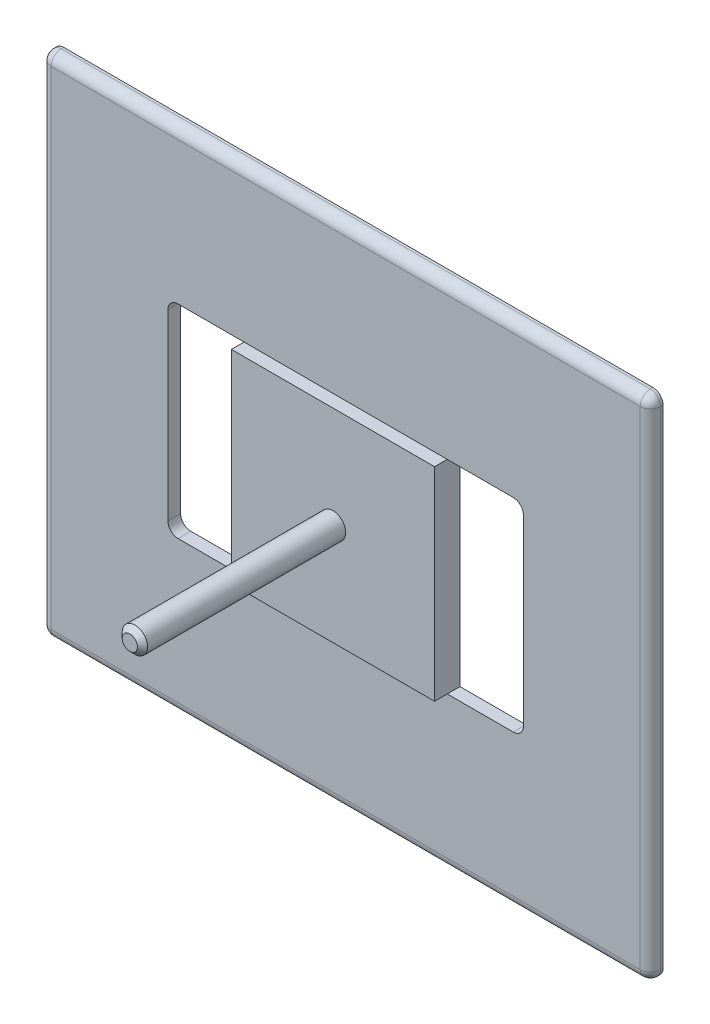
ISO-10303-21;
HEADER;
FILE_DESCRIPTION(('STEP AP214'),'2;1');
FILE_NAME('part.step','',(''),(''),'','','');
FILE_SCHEMA(('AUTOMOTIVE_DESIGN { 1 0 10303 214 1 1 1 1 }'));
ENDSEC;
DATA;
#1=APPLICATION_CONTEXT('core data for automotive mechanical design processes');
#2=APPLICATION_PROTOCOL_DEFINITION('international standard','automotive_design',2000,#1);
#3=PRODUCT_CONTEXT('',#1,'mechanical');
#4=PRODUCT('Part','Part','',(#3));
#5=PRODUCT_RELATED_PRODUCT_CATEGORY('part','',(#4));
#6=PRODUCT_DEFINITION_FORMATION('','',#4);
#7=PRODUCT_DEFINITION_CONTEXT('part definition',#1,'design');
#8=PRODUCT_DEFINITION('design','',#6,#7);
#9=PRODUCT_DEFINITION_SHAPE('','',#8);
#10=(LENGTH_UNIT() NAMED_UNIT(*) SI_UNIT(.MILLI.,.METRE.));
#11=(NAMED_UNIT(*) PLANE_ANGLE_UNIT() SI_UNIT($,.RADIAN.));
#12=(NAMED_UNIT(*) SI_UNIT($,.STERADIAN.) SOLID_ANGLE_UNIT());
#13=UNCERTAINTY_MEASURE_WITH_UNIT(LENGTH_MEASURE(1.E-05),#10,'distance_accuracy_value','');
#14=(GEOMETRIC_REPRESENTATION_CONTEXT(3) GLOBAL_UNCERTAINTY_ASSIGNED_CONTEXT((#13)) GLOBAL_UNIT_ASSIGNED_CONTEXT((#10,
#11,#12)) REPRESENTATION_CONTEXT('',''));
#15=CARTESIAN_POINT('',(0.,0.,0.));
#16=DIRECTION('',(0.,0.,1.));
#17=DIRECTION('',(1.,0.,0.));
#18=AXIS2_PLACEMENT_3D('',#15,#16,#17);
#19=CARTESIAN_POINT('',(0.,0.,5.));
#20=DIRECTION('',(0.,0.,-1.));
#21=DIRECTION('',(-1.,0.,0.));
#22=AXIS2_PLACEMENT_3D('',#19,#20,#21);
#23=PLANE('',#22);
#24=CARTESIAN_POINT('',(0.,0.,5.));
#25=DIRECTION('',(0.,0.,1.));
#26=DIRECTION('',(1.,0.,0.));
#27=AXIS2_PLACEMENT_3D('',#24,#25,#26);
#28=CIRCLE('',#27,2.5);
#29=CARTESIAN_POINT('',(-2.5,0.,5.));
#30=VERTEX_POINT('',#29);
#31=EDGE_CURVE('E292',#30,#30,#28,.T.);
#32=ORIENTED_EDGE('',*,*,#31,.F.);
#33=EDGE_LOOP('',(#32));
#34=FACE_BOUND('',#33,.T.);
#35=DIRECTION('',(0.,1.,0.));
#36=VECTOR('',#35,1.);
#37=CARTESIAN_POINT('',(20.,-20.,5.));
#38=LINE('',#37,#36);
#39=CARTESIAN_POINT('',(20.,-20.,5.));
#40=VERTEX_POINT('',#39);
#41=CARTESIAN_POINT('',(20.,20.,5.));
#42=VERTEX_POINT('',#41);
#43=EDGE_CURVE('E245',#40,#42,#38,.T.);
#44=ORIENTED_EDGE('',*,*,#43,.T.);
#45=DIRECTION('',(-1.,0.,0.));
#46=VECTOR('',#45,1.);
#47=CARTESIAN_POINT('',(-20.,20.,5.));
#48=LINE('',#47,#46);
#49=CARTESIAN_POINT('',(-20.,20.,5.));
#50=VERTEX_POINT('',#49);
#51=EDGE_CURVE('E280',#42,#50,#48,.T.);
#52=ORIENTED_EDGE('',*,*,#51,.T.);
#53=DIRECTION('',(0.,-1.,0.));
#54=VECTOR('',#53,1.);
#55=CARTESIAN_POINT('',(-20.,-20.,5.));
#56=LINE('',#55,#54);
#57=CARTESIAN_POINT('',(-20.,-20.,5.));
#58=VERTEX_POINT('',#57);
#59=EDGE_CURVE('E284',#50,#58,#56,.T.);
#60=ORIENTED_EDGE('',*,*,#59,.T.);
#61=DIRECTION('',(1.,0.,0.));
#62=VECTOR('',#61,1.);
#63=CARTESIAN_POINT('',(-20.,-20.,5.));
#64=LINE('',#63,#62);
#65=EDGE_CURVE('E274',#58,#40,#64,.T.);
#66=ORIENTED_EDGE('',*,*,#65,.T.);
#67=EDGE_LOOP('',(#44,#52,#60,#66));
#68=FACE_BOUND('',#67,.T.);
#69=ADVANCED_FACE('F45',(#34,#68),#23,.F.);
#70=CARTESIAN_POINT('',(0.,0.,45.));
#71=DIRECTION('',(0.,0.,-1.));
#72=DIRECTION('',(-1.,0.,0.));
#73=AXIS2_PLACEMENT_3D('',#70,#71,#72);
#74=CYLINDRICAL_SURFACE('',#73,2.5);
#75=CARTESIAN_POINT('',(0.,0.,44.0000000000001));
#76=DIRECTION('',(0.,0.,1.));
#77=DIRECTION('',(1.,0.,0.));
#78=AXIS2_PLACEMENT_3D('',#75,#76,#77);
#79=CIRCLE('',#78,2.5);
#80=CARTESIAN_POINT('',(-2.5,0.,44.0000000000001));
#81=VERTEX_POINT('',#80);
#82=EDGE_CURVE('E315',#81,#81,#79,.F.);
#83=CARTESIAN_POINT('',(-2.5,0.,44.0000000000001));
#84=CARTESIAN_POINT('',(-2.5,0.,43.5937500000001));
#85=CARTESIAN_POINT('',(-2.5,0.,43.1875000000001));
#86=CARTESIAN_POINT('',(-2.5,0.,42.3750000000001));
#87=CARTESIAN_POINT('',(-2.5,0.,41.9687500000001));
#88=CARTESIAN_POINT('',(-2.5,0.,41.1562500000001));
#89=CARTESIAN_POINT('',(-2.5,0.,40.7500000000001));
#90=CARTESIAN_POINT('',(-2.5,0.,39.9375000000001));
#91=CARTESIAN_POINT('',(-2.5,0.,39.5312500000001));
#92=CARTESIAN_POINT('',(-2.5,0.,38.7187500000001));
#93=CARTESIAN_POINT('',(-2.5,0.,38.3125000000001));
#94=CARTESIAN_POINT('',(-2.5,0.,37.5000000000001));
#95=CARTESIAN_POINT('',(-2.5,0.,37.0937500000001));
#96=CARTESIAN_POINT('',(-2.5,0.,36.2812500000001));
#97=CARTESIAN_POINT('',(-2.5,0.,35.8750000000001));
#98=CARTESIAN_POINT('',(-2.5,0.,35.0625));
#99=CARTESIAN_POINT('',(-2.5,0.,34.6562500000001));
#100=CARTESIAN_POINT('',(-2.5,0.,33.8437500000001));
#101=CARTESIAN_POINT('',(-2.5,0.,33.4375));
#102=CARTESIAN_POINT('',(-2.5,0.,32.625));
#103=CARTESIAN_POINT('',(-2.5,0.,32.21875));
#104=CARTESIAN_POINT('',(-2.5,0.,31.40625));
#105=CARTESIAN_POINT('',(-2.5,0.,31.));
#106=CARTESIAN_POINT('',(-2.5,0.,30.1875));
#107=CARTESIAN_POINT('',(-2.5,0.,29.78125));
#108=CARTESIAN_POINT('',(-2.5,0.,28.96875));
#109=CARTESIAN_POINT('',(-2.5,0.,28.5625));
#110=CARTESIAN_POINT('',(-2.5,0.,27.75));
#111=CARTESIAN_POINT('',(-2.5,0.,27.34375));
#112=CARTESIAN_POINT('',(-2.5,0.,26.53125));
#113=CARTESIAN_POINT('',(-2.5,0.,26.125));
#114=CARTESIAN_POINT('',(-2.5,0.,25.3125));
#115=CARTESIAN_POINT('',(-2.5,0.,24.90625));
#116=CARTESIAN_POINT('',(-2.5,0.,24.09375));
#117=CARTESIAN_POINT('',(-2.5,0.,23.6875));
#118=CARTESIAN_POINT('',(-2.5,0.,22.875));
#119=CARTESIAN_POINT('',(-2.5,0.,22.46875));
#120=CARTESIAN_POINT('',(-2.5,0.,21.65625));
#121=CARTESIAN_POINT('',(-2.5,0.,21.25));
#122=CARTESIAN_POINT('',(-2.5,0.,20.4375));
#123=CARTESIAN_POINT('',(-2.5,0.,20.03125));
#124=CARTESIAN_POINT('',(-2.5,0.,19.21875));
#125=CARTESIAN_POINT('',(-2.5,0.,18.8125));
#126=CARTESIAN_POINT('',(-2.5,0.,18.));
#127=CARTESIAN_POINT('',(-2.5,0.,17.59375));
#128=CARTESIAN_POINT('',(-2.5,0.,16.78125));
#129=CARTESIAN_POINT('',(-2.5,0.,16.375));
#130=CARTESIAN_POINT('',(-2.5,0.,15.5625));
#131=CARTESIAN_POINT('',(-2.5,0.,15.15625));
#132=CARTESIAN_POINT('',(-2.5,0.,14.34375));
#133=CARTESIAN_POINT('',(-2.5,0.,13.9375));
#134=CARTESIAN_POINT('',(-2.5,0.,13.125));
#135=CARTESIAN_POINT('',(-2.5,0.,12.71875));
#136=CARTESIAN_POINT('',(-2.5,0.,11.90625));
#137=CARTESIAN_POINT('',(-2.5,0.,11.5));
#138=CARTESIAN_POINT('',(-2.5,0.,10.6875));
#139=CARTESIAN_POINT('',(-2.5,0.,10.28125));
#140=CARTESIAN_POINT('',(-2.5,0.,9.46875000000001));
#141=CARTESIAN_POINT('',(-2.5,0.,9.06250000000001));
#142=CARTESIAN_POINT('',(-2.5,0.,8.25000000000001));
#143=CARTESIAN_POINT('',(-2.5,0.,7.84375000000001));
#144=CARTESIAN_POINT('',(-2.5,0.,7.03125000000001));
#145=CARTESIAN_POINT('',(-2.5,0.,6.625));
#146=CARTESIAN_POINT('',(-2.5,0.,5.8125));
#147=CARTESIAN_POINT('',(-2.5,0.,5.40625));
#148=CARTESIAN_POINT('',(-2.5,0.,5.));
#149=B_SPLINE_CURVE_WITH_KNOTS('',3,(#83,#84,#85,#86,#87,#88,#89,#90,#91,#92,#93,#94,#95,#96,
#97,#98,#99,#100,#101,#102,#103,#104,#105,#106,#107,#108,#109,#110,#111,#112,#113,#114,#115,
#116,#117,#118,#119,#120,#121,#122,#123,#124,#125,#126,#127,#128,#129,#130,#131,#132,#133,#134,
#135,#136,#137,#138,#139,#140,#141,#142,#143,#144,#145,#146,#147,#148),.UNSPECIFIED.,.F.,.F.,(4,
2,2,2,2,2,2,2,2,2,2,2,2,2,2,2,2,2,2,2,2,2,2,2,2,2,2,2,2,2,2,2,4),(0.,1.21875,2.43750000000001,
3.65625000000001,4.87500000000001,6.09375000000002,7.31250000000001,8.53125000000002,
9.75000000000002,10.96875,12.1875,13.40625,14.625,15.84375,17.0625,18.28125,19.5,20.71875,
21.9375,23.15625,24.375,25.59375,26.8125000000001,28.0312500000001,29.2500000000001,
30.4687500000001,31.6875000000001,32.9062500000001,34.1250000000001,35.3437500000001,
36.5625000000001,37.7812500000001,39.0000000000001),.UNSPECIFIED.);
#150=EDGE_CURVE('BSEAM476',#81,#30,#149,.T.);
#151=ORIENTED_EDGE('',*,*,#82,.T.);
#152=ORIENTED_EDGE('',*,*,#31,.T.);
#153=ORIENTED_EDGE('',*,*,#150,.T.);
#154=ORIENTED_EDGE('',*,*,#150,.F.);
#155=EDGE_LOOP('',(#151,#153,#152,#154));
#156=FACE_BOUND('',#155,.T.);
#157=ADVANCED_FACE('F476',(#156),#74,.T.);
#158=CARTESIAN_POINT('',(0.,0.,45.));
#159=DIRECTION('',(0.,0.,1.));
#160=DIRECTION('',(1.,0.,0.));
#161=AXIS2_PLACEMENT_3D('',#158,#159,#160);
#162=PLANE('',#161);
#163=CARTESIAN_POINT('',(0.,0.,45.));
#164=DIRECTION('',(0.,0.,1.));
#165=DIRECTION('',(1.,0.,0.));
#166=AXIS2_PLACEMENT_3D('',#163,#164,#165);
#167=CIRCLE('',#166,1.50000000000008);
#168=CARTESIAN_POINT('',(1.50000000000008,0.,45.));
#169=VERTEX_POINT('',#168);
#170=EDGE_CURVE('E312',#169,#169,#167,.T.);
#171=ORIENTED_EDGE('',*,*,#170,.T.);
#172=EDGE_LOOP('',(#171));
#173=FACE_BOUND('',#172,.T.);
#174=ADVANCED_FACE('F482',(#173),#162,.T.);
#175=CARTESIAN_POINT('',(0.,0.,45.));
#176=DIRECTION('',(0.,0.,-1.));
#177=DIRECTION('',(-1.,0.,0.));
#178=AXIS2_PLACEMENT_3D('',#175,#176,#177);
#179=CONICAL_SURFACE('',#178,1.50000000000008,0.785398163397444);
#180=ORIENTED_EDGE('',*,*,#82,.F.);
#181=EDGE_LOOP('',(#180));
#182=FACE_BOUND('',#181,.T.);
#183=ORIENTED_EDGE('',*,*,#170,.F.);
#184=EDGE_LOOP('',(#183));
#185=FACE_BOUND('',#184,.T.);
#186=ADVANCED_FACE('F507',(#182,#185),#179,.T.);
#187=CARTESIAN_POINT('',(0.,0.,2.5));
#188=DIRECTION('',(0.,0.,-1.));
#189=DIRECTION('',(-1.,0.,0.));
#190=AXIS2_PLACEMENT_3D('',#187,#188,#189);
#191=PLANE('',#190);
#192=DIRECTION('',(0.,-1.,0.));
#193=VECTOR('',#192,1.);
#194=CARTESIAN_POINT('',(-58.,0.,2.5));
#195=LINE('',#194,#193);
#196=CARTESIAN_POINT('',(-58.,48.,2.5));
#197=VERTEX_POINT('',#196);
#198=CARTESIAN_POINT('',(-58.,-48.,2.5));
#199=VERTEX_POINT('',#198);
#200=EDGE_CURVE('E323',#197,#199,#195,.T.);
#201=ORIENTED_EDGE('',*,*,#200,.T.);
#202=DIRECTION('',(1.,0.,0.));
#203=VECTOR('',#202,1.);
#204=CARTESIAN_POINT('',(0.,-48.,2.5));
#205=LINE('',#204,#203);
#206=CARTESIAN_POINT('',(58.,-48.,2.5));
#207=VERTEX_POINT('',#206);
#208=EDGE_CURVE('E325',#199,#207,#205,.T.);
#209=ORIENTED_EDGE('',*,*,#208,.T.);
#210=DIRECTION('',(0.,1.,0.));
#211=VECTOR('',#210,1.);
#212=CARTESIAN_POINT('',(58.,0.,2.5));
#213=LINE('',#212,#211);
#214=CARTESIAN_POINT('',(58.,48.,2.5));
#215=VERTEX_POINT('',#214);
#216=EDGE_CURVE('E318',#207,#215,#213,.T.);
#217=ORIENTED_EDGE('',*,*,#216,.T.);
#218=DIRECTION('',(-1.,0.,0.));
#219=VECTOR('',#218,1.);
#220=CARTESIAN_POINT('',(0.,48.,2.5));
#221=LINE('',#220,#219);
#222=EDGE_CURVE('E320',#215,#197,#221,.T.);
#223=ORIENTED_EDGE('',*,*,#222,.T.);
#224=EDGE_LOOP('',(#201,#209,#217,#223));
#225=FACE_BOUND('',#224,.T.);
#226=DIRECTION('',(1.,0.,0.));
#227=VECTOR('',#226,1.);
#228=CARTESIAN_POINT('',(-20.,-20.,2.5));
#229=LINE('',#228,#227);
#230=CARTESIAN_POINT('',(-20.,-20.,2.5));
#231=VERTEX_POINT('',#230);
#232=CARTESIAN_POINT('',(20.,-20.,2.5));
#233=VERTEX_POINT('',#232);
#234=EDGE_CURVE('E273',#231,#233,#229,.T.);
#235=ORIENTED_EDGE('',*,*,#234,.F.);
#236=DIRECTION('',(1.,0.,0.));
#237=VECTOR('',#236,1.);
#238=CARTESIAN_POINT('',(-20.,-20.,2.5));
#239=LINE('',#238,#237);
#240=CARTESIAN_POINT('',(-33.,-20.,2.5));
#241=VERTEX_POINT('',#240);
#242=EDGE_CURVE('E232',#241,#231,#239,.T.);
#243=ORIENTED_EDGE('',*,*,#242,.F.);
#244=CARTESIAN_POINT('',(-33.,-18.,2.5));
#245=DIRECTION('',(0.,0.,-1.));
#246=DIRECTION('',(-1.,0.,0.));
#247=AXIS2_PLACEMENT_3D('',#244,#245,#246);
#248=CIRCLE('',#247,2.);
#249=CARTESIAN_POINT('',(-35.,-18.,2.5));
#250=VERTEX_POINT('',#249);
#251=EDGE_CURVE('E413',#241,#250,#248,.T.);
#252=ORIENTED_EDGE('',*,*,#251,.T.);
#253=DIRECTION('',(0.,-1.,0.));
#254=VECTOR('',#253,1.);
#255=CARTESIAN_POINT('',(-35.,20.,2.5));
#256=LINE('',#255,#254);
#257=CARTESIAN_POINT('',(-35.,18.,2.5));
#258=VERTEX_POINT('',#257);
#259=EDGE_CURVE('E234',#258,#250,#256,.T.);
#260=ORIENTED_EDGE('',*,*,#259,.F.);
#261=CARTESIAN_POINT('',(-33.,18.,2.5));
#262=DIRECTION('',(0.,0.,-1.));
#263=DIRECTION('',(-1.,0.,0.));
#264=AXIS2_PLACEMENT_3D('',#261,#262,#263);
#265=CIRCLE('',#264,2.);
#266=CARTESIAN_POINT('',(-33.,20.,2.5));
#267=VERTEX_POINT('',#266);
#268=EDGE_CURVE('E421',#258,#267,#265,.T.);
#269=ORIENTED_EDGE('',*,*,#268,.T.);
#270=DIRECTION('',(-1.,0.,0.));
#271=VECTOR('',#270,1.);
#272=CARTESIAN_POINT('',(-20.,20.,2.5));
#273=LINE('',#272,#271);
#274=CARTESIAN_POINT('',(-20.,20.,2.5));
#275=VERTEX_POINT('',#274);
#276=EDGE_CURVE('E240',#275,#267,#273,.T.);
#277=ORIENTED_EDGE('',*,*,#276,.F.);
#278=DIRECTION('',(-1.,0.,0.));
#279=VECTOR('',#278,1.);
#280=CARTESIAN_POINT('',(-20.,20.,2.5));
#281=LINE('',#280,#279);
#282=CARTESIAN_POINT('',(20.,20.,2.5));
#283=VERTEX_POINT('',#282);
#284=EDGE_CURVE('E270',#283,#275,#281,.T.);
#285=ORIENTED_EDGE('',*,*,#284,.F.);
#286=DIRECTION('',(-1.,0.,0.));
#287=VECTOR('',#286,1.);
#288=CARTESIAN_POINT('',(20.,20.,2.5));
#289=LINE('',#288,#287);
#290=CARTESIAN_POINT('',(33.,20.,2.5));
#291=VERTEX_POINT('',#290);
#292=EDGE_CURVE('E254',#291,#283,#289,.T.);
#293=ORIENTED_EDGE('',*,*,#292,.F.);
#294=CARTESIAN_POINT('',(33.,18.,2.5));
#295=DIRECTION('',(0.,0.,-1.));
#296=DIRECTION('',(-1.,0.,0.));
#297=AXIS2_PLACEMENT_3D('',#294,#295,#296);
#298=CIRCLE('',#297,2.);
#299=CARTESIAN_POINT('',(35.,18.,2.5));
#300=VERTEX_POINT('',#299);
#301=EDGE_CURVE('E53',#291,#300,#298,.T.);
#302=ORIENTED_EDGE('',*,*,#301,.T.);
#303=DIRECTION('',(0.,1.,0.));
#304=VECTOR('',#303,1.);
#305=CARTESIAN_POINT('',(35.,20.,2.5));
#306=LINE('',#305,#304);
#307=CARTESIAN_POINT('',(35.,-18.,2.5));
#308=VERTEX_POINT('',#307);
#309=EDGE_CURVE('E256',#308,#300,#306,.T.);
#310=ORIENTED_EDGE('',*,*,#309,.F.);
#311=CARTESIAN_POINT('',(33.,-18.,2.5));
#312=DIRECTION('',(0.,0.,-1.));
#313=DIRECTION('',(-1.,0.,0.));
#314=AXIS2_PLACEMENT_3D('',#311,#312,#313);
#315=CIRCLE('',#314,2.);
#316=CARTESIAN_POINT('',(33.,-20.,2.5));
#317=VERTEX_POINT('',#316);
#318=EDGE_CURVE('E417',#308,#317,#315,.T.);
#319=ORIENTED_EDGE('',*,*,#318,.T.);
#320=DIRECTION('',(1.,0.,0.));
#321=VECTOR('',#320,1.);
#322=CARTESIAN_POINT('',(20.,-20.,2.5));
#323=LINE('',#322,#321);
#324=EDGE_CURVE('E242',#233,#317,#323,.T.);
#325=ORIENTED_EDGE('',*,*,#324,.F.);
#326=EDGE_LOOP('',(#235,#243,#252,#260,#269,#277,#285,#293,#302,#310,#319,#325));
#327=FACE_BOUND('',#326,.T.);
#328=ADVANCED_FACE('F428',(#225,#327),#191,.F.);
#329=CARTESIAN_POINT('',(20.,-20.,2.5));
#330=DIRECTION('',(1.,0.,0.));
#331=DIRECTION('',(0.,1.,0.));
#332=AXIS2_PLACEMENT_3D('',#329,#330,#331);
#333=PLANE('',#332);
#334=ORIENTED_EDGE('',*,*,#43,.F.);
#335=DIRECTION('',(0.,0.,1.));
#336=VECTOR('',#335,1.);
#337=CARTESIAN_POINT('',(20.,-20.,2.5));
#338=LINE('',#337,#336);
#339=EDGE_CURVE('E290',#233,#40,#338,.T.);
#340=ORIENTED_EDGE('',*,*,#339,.F.);
#341=DIRECTION('',(0.,0.,1.));
#342=VECTOR('',#341,1.);
#343=CARTESIAN_POINT('',(20.,-20.,0.));
#344=LINE('',#343,#342);
#345=CARTESIAN_POINT('',(20.,-20.,0.));
#346=VERTEX_POINT('',#345);
#347=EDGE_CURVE('E247',#346,#233,#344,.T.);
#348=ORIENTED_EDGE('',*,*,#347,.F.);
#349=DIRECTION('',(0.,-1.,0.));
#350=VECTOR('',#349,1.);
#351=CARTESIAN_POINT('',(20.,20.,0.));
#352=LINE('',#351,#350);
#353=CARTESIAN_POINT('',(20.,20.,0.));
#354=VERTEX_POINT('',#353);
#355=EDGE_CURVE('E257',#354,#346,#352,.T.);
#356=ORIENTED_EDGE('',*,*,#355,.F.);
#357=DIRECTION('',(0.,0.,1.));
#358=VECTOR('',#357,1.);
#359=CARTESIAN_POINT('',(20.,20.,0.));
#360=LINE('',#359,#358);
#361=EDGE_CURVE('E250',#354,#283,#360,.T.);
#362=ORIENTED_EDGE('',*,*,#361,.T.);
#363=DIRECTION('',(0.,0.,1.));
#364=VECTOR('',#363,1.);
#365=CARTESIAN_POINT('',(20.,20.,2.5));
#366=LINE('',#365,#364);
#367=EDGE_CURVE('E277',#283,#42,#366,.T.);
#368=ORIENTED_EDGE('',*,*,#367,.T.);
#369=EDGE_LOOP('',(#334,#340,#348,#356,#362,#368));
#370=FACE_BOUND('',#369,.T.);
#371=ADVANCED_FACE('F443',(#370),#333,.T.);
#372=CARTESIAN_POINT('',(-20.,-20.,2.5));
#373=DIRECTION('',(0.,-1.,0.));
#374=DIRECTION('',(1.,0.,0.));
#375=AXIS2_PLACEMENT_3D('',#372,#373,#374);
#376=PLANE('',#375);
#377=ORIENTED_EDGE('',*,*,#65,.F.);
#378=DIRECTION('',(0.,0.,1.));
#379=VECTOR('',#378,1.);
#380=CARTESIAN_POINT('',(-20.,-20.,2.5));
#381=LINE('',#380,#379);
#382=EDGE_CURVE('E293',#231,#58,#381,.T.);
#383=ORIENTED_EDGE('',*,*,#382,.F.);
#384=ORIENTED_EDGE('',*,*,#234,.T.);
#385=ORIENTED_EDGE('',*,*,#339,.T.);
#386=EDGE_LOOP('',(#377,#383,#384,#385));
#387=FACE_BOUND('',#386,.T.);
#388=ADVANCED_FACE('F456',(#387),#376,.T.);
#389=CARTESIAN_POINT('',(-20.,-20.,2.5));
#390=DIRECTION('',(-1.,0.,0.));
#391=DIRECTION('',(0.,0.,1.));
#392=AXIS2_PLACEMENT_3D('',#389,#390,#391);
#393=PLANE('',#392);
#394=ORIENTED_EDGE('',*,*,#59,.F.);
#395=DIRECTION('',(0.,0.,1.));
#396=VECTOR('',#395,1.);
#397=CARTESIAN_POINT('',(-20.,20.,2.5));
#398=LINE('',#397,#396);
#399=EDGE_CURVE('E212',#275,#50,#398,.T.);
#400=ORIENTED_EDGE('',*,*,#399,.F.);
#401=DIRECTION('',(0.,0.,1.));
#402=VECTOR('',#401,1.);
#403=CARTESIAN_POINT('',(-20.,20.,0.));
#404=LINE('',#403,#402);
#405=CARTESIAN_POINT('',(-20.,20.,0.));
#406=VERTEX_POINT('',#405);
#407=EDGE_CURVE('E205',#406,#275,#404,.T.);
#408=ORIENTED_EDGE('',*,*,#407,.F.);
#409=DIRECTION('',(0.,1.,0.));
#410=VECTOR('',#409,1.);
#411=CARTESIAN_POINT('',(-20.,20.,0.));
#412=LINE('',#411,#410);
#413=CARTESIAN_POINT('',(-20.,-20.,0.));
#414=VERTEX_POINT('',#413);
#415=EDGE_CURVE('E210',#414,#406,#412,.T.);
#416=ORIENTED_EDGE('',*,*,#415,.F.);
#417=DIRECTION('',(0.,0.,1.));
#418=VECTOR('',#417,1.);
#419=CARTESIAN_POINT('',(-20.,-20.,0.));
#420=LINE('',#419,#418);
#421=EDGE_CURVE('E217',#414,#231,#420,.T.);
#422=ORIENTED_EDGE('',*,*,#421,.T.);
#423=ORIENTED_EDGE('',*,*,#382,.T.);
#424=EDGE_LOOP('',(#394,#400,#408,#416,#422,#423));
#425=FACE_BOUND('',#424,.T.);
#426=ADVANCED_FACE('F207',(#425),#393,.T.);
#427=CARTESIAN_POINT('',(-20.,20.,2.5));
#428=DIRECTION('',(0.,1.,0.));
#429=DIRECTION('',(-1.,0.,0.));
#430=AXIS2_PLACEMENT_3D('',#427,#428,#429);
#431=PLANE('',#430);
#432=ORIENTED_EDGE('',*,*,#51,.F.);
#433=ORIENTED_EDGE('',*,*,#367,.F.);
#434=ORIENTED_EDGE('',*,*,#284,.T.);
#435=ORIENTED_EDGE('',*,*,#399,.T.);
#436=EDGE_LOOP('',(#432,#433,#434,#435));
#437=FACE_BOUND('',#436,.T.);
#438=ADVANCED_FACE('F473',(#437),#431,.T.);
#439=CARTESIAN_POINT('',(0.,0.,0.));
#440=DIRECTION('',(0.,0.,-1.));
#441=DIRECTION('',(-1.,0.,0.));
#442=AXIS2_PLACEMENT_3D('',#439,#440,#441);
#443=PLANE('',#442);
#444=ORIENTED_EDGE('',*,*,#415,.T.);
#445=DIRECTION('',(-1.,0.,0.));
#446=VECTOR('',#445,1.);
#447=CARTESIAN_POINT('',(-20.,20.,0.));
#448=LINE('',#447,#446);
#449=CARTESIAN_POINT('',(-33.,20.,0.));
#450=VERTEX_POINT('',#449);
#451=EDGE_CURVE('E221',#406,#450,#448,.T.);
#452=ORIENTED_EDGE('',*,*,#451,.T.);
#453=CARTESIAN_POINT('',(-33.,18.,0.));
#454=DIRECTION('',(0.,0.,-1.));
#455=DIRECTION('',(-1.,0.,0.));
#456=AXIS2_PLACEMENT_3D('',#453,#454,#455);
#457=CIRCLE('',#456,2.);
#458=CARTESIAN_POINT('',(-35.,18.,0.));
#459=VERTEX_POINT('',#458);
#460=EDGE_CURVE('E423',#450,#459,#457,.F.);
#461=ORIENTED_EDGE('',*,*,#460,.T.);
#462=DIRECTION('',(0.,-1.,0.));
#463=VECTOR('',#462,1.);
#464=CARTESIAN_POINT('',(-35.,20.,0.));
#465=LINE('',#464,#463);
#466=CARTESIAN_POINT('',(-35.,-18.,0.));
#467=VERTEX_POINT('',#466);
#468=EDGE_CURVE('E227',#459,#467,#465,.T.);
#469=ORIENTED_EDGE('',*,*,#468,.T.);
#470=CARTESIAN_POINT('',(-33.,-18.,0.));
#471=DIRECTION('',(0.,0.,-1.));
#472=DIRECTION('',(-1.,0.,0.));
#473=AXIS2_PLACEMENT_3D('',#470,#471,#472);
#474=CIRCLE('',#473,2.);
#475=CARTESIAN_POINT('',(-33.,-20.,0.));
#476=VERTEX_POINT('',#475);
#477=EDGE_CURVE('E415',#467,#476,#474,.F.);
#478=ORIENTED_EDGE('',*,*,#477,.T.);
#479=DIRECTION('',(1.,0.,0.));
#480=VECTOR('',#479,1.);
#481=CARTESIAN_POINT('',(-20.,-20.,0.));
#482=LINE('',#481,#480);
#483=EDGE_CURVE('E218',#476,#414,#482,.T.);
#484=ORIENTED_EDGE('',*,*,#483,.T.);
#485=EDGE_LOOP('',(#444,#452,#461,#469,#478,#484));
#486=FACE_BOUND('',#485,.T.);
#487=ORIENTED_EDGE('',*,*,#355,.T.);
#488=DIRECTION('',(1.,0.,0.));
#489=VECTOR('',#488,1.);
#490=CARTESIAN_POINT('',(20.,-20.,0.));
#491=LINE('',#490,#489);
#492=CARTESIAN_POINT('',(33.,-20.,0.));
#493=VERTEX_POINT('',#492);
#494=EDGE_CURVE('E265',#346,#493,#491,.T.);
#495=ORIENTED_EDGE('',*,*,#494,.T.);
#496=CARTESIAN_POINT('',(33.,-18.,0.));
#497=DIRECTION('',(0.,0.,-1.));
#498=DIRECTION('',(-1.,0.,0.));
#499=AXIS2_PLACEMENT_3D('',#496,#497,#498);
#500=CIRCLE('',#499,2.);
#501=CARTESIAN_POINT('',(35.,-18.,0.));
#502=VERTEX_POINT('',#501);
#503=EDGE_CURVE('E419',#493,#502,#500,.F.);
#504=ORIENTED_EDGE('',*,*,#503,.T.);
#505=DIRECTION('',(0.,1.,0.));
#506=VECTOR('',#505,1.);
#507=CARTESIAN_POINT('',(35.,20.,0.));
#508=LINE('',#507,#506);
#509=CARTESIAN_POINT('',(35.,18.,0.));
#510=VERTEX_POINT('',#509);
#511=EDGE_CURVE('E263',#502,#510,#508,.T.);
#512=ORIENTED_EDGE('',*,*,#511,.T.);
#513=CARTESIAN_POINT('',(33.,18.,0.));
#514=DIRECTION('',(0.,0.,-1.));
#515=DIRECTION('',(-1.,0.,0.));
#516=AXIS2_PLACEMENT_3D('',#513,#514,#515);
#517=CIRCLE('',#516,2.);
#518=CARTESIAN_POINT('',(33.,20.,0.));
#519=VERTEX_POINT('',#518);
#520=EDGE_CURVE('E11',#510,#519,#517,.F.);
#521=ORIENTED_EDGE('',*,*,#520,.T.);
#522=DIRECTION('',(-1.,0.,0.));
#523=VECTOR('',#522,1.);
#524=CARTESIAN_POINT('',(20.,20.,0.));
#525=LINE('',#524,#523);
#526=EDGE_CURVE('E249',#519,#354,#525,.T.);
#527=ORIENTED_EDGE('',*,*,#526,.T.);
#528=EDGE_LOOP('',(#487,#495,#504,#512,#521,#527));
#529=FACE_BOUND('',#528,.T.);
#530=DIRECTION('',(0.,-1.,0.));
#531=VECTOR('',#530,1.);
#532=CARTESIAN_POINT('',(-60.,-50.,0.));
#533=LINE('',#532,#531);
#534=CARTESIAN_POINT('',(-60.,48.,0.));
#535=VERTEX_POINT('',#534);
#536=CARTESIAN_POINT('',(-60.,-48.,0.));
#537=VERTEX_POINT('',#536);
#538=EDGE_CURVE('E306',#535,#537,#533,.T.);
#539=ORIENTED_EDGE('',*,*,#538,.F.);
#540=CARTESIAN_POINT('',(-58.,48.,0.));
#541=DIRECTION('',(0.,0.,-1.));
#542=DIRECTION('',(-1.,0.,0.));
#543=AXIS2_PLACEMENT_3D('',#540,#541,#542);
#544=CIRCLE('',#543,2.);
#545=CARTESIAN_POINT('',(-58.,50.,0.));
#546=VERTEX_POINT('',#545);
#547=EDGE_CURVE('E360',#535,#546,#544,.T.);
#548=ORIENTED_EDGE('',*,*,#547,.T.);
#549=DIRECTION('',(-1.,0.,0.));
#550=VECTOR('',#549,1.);
#551=CARTESIAN_POINT('',(-60.,50.,0.));
#552=LINE('',#551,#550);
#553=CARTESIAN_POINT('',(58.,50.,0.));
#554=VERTEX_POINT('',#553);
#555=EDGE_CURVE('E302',#554,#546,#552,.T.);
#556=ORIENTED_EDGE('',*,*,#555,.F.);
#557=CARTESIAN_POINT('',(58.,48.,0.));
#558=DIRECTION('',(0.,0.,-1.));
#559=DIRECTION('',(-1.,0.,0.));
#560=AXIS2_PLACEMENT_3D('',#557,#558,#559);
#561=CIRCLE('',#560,2.);
#562=CARTESIAN_POINT('',(60.,48.,0.));
#563=VERTEX_POINT('',#562);
#564=EDGE_CURVE('E358',#554,#563,#561,.T.);
#565=ORIENTED_EDGE('',*,*,#564,.T.);
#566=DIRECTION('',(0.,1.,0.));
#567=VECTOR('',#566,1.);
#568=CARTESIAN_POINT('',(60.,-50.,0.));
#569=LINE('',#568,#567);
#570=CARTESIAN_POINT('',(60.,-48.,0.));
#571=VERTEX_POINT('',#570);
#572=EDGE_CURVE('E299',#571,#563,#569,.T.);
#573=ORIENTED_EDGE('',*,*,#572,.F.);
#574=CARTESIAN_POINT('',(58.,-48.,0.));
#575=DIRECTION('',(0.,0.,-1.));
#576=DIRECTION('',(-1.,0.,0.));
#577=AXIS2_PLACEMENT_3D('',#574,#575,#576);
#578=CIRCLE('',#577,2.);
#579=CARTESIAN_POINT('',(58.,-50.,0.));
#580=VERTEX_POINT('',#579);
#581=EDGE_CURVE('E356',#571,#580,#578,.T.);
#582=ORIENTED_EDGE('',*,*,#581,.T.);
#583=DIRECTION('',(1.,0.,0.));
#584=VECTOR('',#583,1.);
#585=CARTESIAN_POINT('',(-60.,-50.,0.));
#586=LINE('',#585,#584);
#587=CARTESIAN_POINT('',(-58.,-50.,0.));
#588=VERTEX_POINT('',#587);
#589=EDGE_CURVE('E309',#588,#580,#586,.T.);
#590=ORIENTED_EDGE('',*,*,#589,.F.);
#591=CARTESIAN_POINT('',(-58.,-48.,0.));
#592=DIRECTION('',(0.,0.,-1.));
#593=DIRECTION('',(-1.,0.,0.));
#594=AXIS2_PLACEMENT_3D('',#591,#592,#593);
#595=CIRCLE('',#594,2.);
#596=EDGE_CURVE('E354',#588,#537,#595,.T.);
#597=ORIENTED_EDGE('',*,*,#596,.T.);
#598=EDGE_LOOP('',(#539,#548,#556,#565,#573,#582,#590,#597));
#599=FACE_BOUND('',#598,.T.);
#600=ADVANCED_FACE('F229',(#486,#529,#599),#443,.T.);
#601=CARTESIAN_POINT('',(-60.,-50.,5.));
#602=DIRECTION('',(0.,1.,0.));
#603=DIRECTION('',(0.,0.,1.));
#604=AXIS2_PLACEMENT_3D('',#601,#602,#603);
#605=PLANE('',#604);
#606=ORIENTED_EDGE('',*,*,#589,.T.);
#607=DIRECTION('',(0.,0.,-1.));
#608=VECTOR('',#607,1.);
#609=CARTESIAN_POINT('',(58.,-50.,5.));
#610=LINE('',#609,#608);
#611=CARTESIAN_POINT('',(58.,-50.,0.5));
#612=VERTEX_POINT('',#611);
#613=EDGE_CURVE('E333',#580,#612,#610,.F.);
#614=ORIENTED_EDGE('',*,*,#613,.T.);
#615=DIRECTION('',(1.,0.,0.));
#616=VECTOR('',#615,1.);
#617=CARTESIAN_POINT('',(-60.,-50.,0.5));
#618=LINE('',#617,#616);
#619=CARTESIAN_POINT('',(-58.,-50.,0.5));
#620=VERTEX_POINT('',#619);
#621=EDGE_CURVE('E330',#612,#620,#618,.F.);
#622=ORIENTED_EDGE('',*,*,#621,.T.);
#623=DIRECTION('',(0.,0.,-1.));
#624=VECTOR('',#623,1.);
#625=CARTESIAN_POINT('',(-58.,-50.,5.));
#626=LINE('',#625,#624);
#627=EDGE_CURVE('E328',#620,#588,#626,.T.);
#628=ORIENTED_EDGE('',*,*,#627,.T.);
#629=EDGE_LOOP('',(#606,#614,#622,#628));
#630=FACE_BOUND('',#629,.T.);
#631=ADVANCED_FACE('F490',(#630),#605,.F.);
#632=CARTESIAN_POINT('',(-60.,-50.,5.));
#633=DIRECTION('',(1.,0.,0.));
#634=DIRECTION('',(0.,1.,0.));
#635=AXIS2_PLACEMENT_3D('',#632,#633,#634);
#636=PLANE('',#635);
#637=DIRECTION('',(0.,-1.,0.));
#638=VECTOR('',#637,1.);
#639=CARTESIAN_POINT('',(-60.,-50.,0.5));
#640=LINE('',#639,#638);
#641=CARTESIAN_POINT('',(-60.,-48.,0.5));
#642=VERTEX_POINT('',#641);
#643=CARTESIAN_POINT('',(-60.,48.,0.5));
#644=VERTEX_POINT('',#643);
#645=EDGE_CURVE('E337',#642,#644,#640,.F.);
#646=ORIENTED_EDGE('',*,*,#645,.T.);
#647=DIRECTION('',(0.,0.,-1.));
#648=VECTOR('',#647,1.);
#649=CARTESIAN_POINT('',(-60.,48.,5.));
#650=LINE('',#649,#648);
#651=EDGE_CURVE('E339',#644,#535,#650,.T.);
#652=ORIENTED_EDGE('',*,*,#651,.T.);
#653=ORIENTED_EDGE('',*,*,#538,.T.);
#654=DIRECTION('',(0.,0.,-1.));
#655=VECTOR('',#654,1.);
#656=CARTESIAN_POINT('',(-60.,-48.,5.));
#657=LINE('',#656,#655);
#658=EDGE_CURVE('E335',#537,#642,#657,.F.);
#659=ORIENTED_EDGE('',*,*,#658,.T.);
#660=EDGE_LOOP('',(#646,#652,#653,#659));
#661=FACE_BOUND('',#660,.T.);
#662=ADVANCED_FACE('F493',(#661),#636,.F.);
#663=CARTESIAN_POINT('',(-60.,50.,5.));
#664=DIRECTION('',(0.,-1.,0.));
#665=DIRECTION('',(0.,0.,-1.));
#666=AXIS2_PLACEMENT_3D('',#663,#664,#665);
#667=PLANE('',#666);
#668=ORIENTED_EDGE('',*,*,#555,.T.);
#669=DIRECTION('',(0.,0.,-1.));
#670=VECTOR('',#669,1.);
#671=CARTESIAN_POINT('',(-58.,50.,5.));
#672=LINE('',#671,#670);
#673=CARTESIAN_POINT('',(-58.,50.,0.5));
#674=VERTEX_POINT('',#673);
#675=EDGE_CURVE('E346',#546,#674,#672,.F.);
#676=ORIENTED_EDGE('',*,*,#675,.T.);
#677=DIRECTION('',(-1.,0.,0.));
#678=VECTOR('',#677,1.);
#679=CARTESIAN_POINT('',(-60.,50.,0.5));
#680=LINE('',#679,#678);
#681=CARTESIAN_POINT('',(58.,50.,0.5));
#682=VERTEX_POINT('',#681);
#683=EDGE_CURVE('E343',#674,#682,#680,.F.);
#684=ORIENTED_EDGE('',*,*,#683,.T.);
#685=DIRECTION('',(0.,0.,-1.));
#686=VECTOR('',#685,1.);
#687=CARTESIAN_POINT('',(58.,50.,5.));
#688=LINE('',#687,#686);
#689=EDGE_CURVE('E341',#682,#554,#688,.T.);
#690=ORIENTED_EDGE('',*,*,#689,.T.);
#691=EDGE_LOOP('',(#668,#676,#684,#690));
#692=FACE_BOUND('',#691,.T.);
#693=ADVANCED_FACE('F497',(#692),#667,.F.);
#694=CARTESIAN_POINT('',(60.,-50.,5.));
#695=DIRECTION('',(-1.,0.,0.));
#696=DIRECTION('',(0.,-1.,0.));
#697=AXIS2_PLACEMENT_3D('',#694,#695,#696);
#698=PLANE('',#697);
#699=ORIENTED_EDGE('',*,*,#572,.T.);
#700=DIRECTION('',(0.,0.,-1.));
#701=VECTOR('',#700,1.);
#702=CARTESIAN_POINT('',(60.,48.,5.));
#703=LINE('',#702,#701);
#704=CARTESIAN_POINT('',(60.,48.,0.5));
#705=VERTEX_POINT('',#704);
#706=EDGE_CURVE('E352',#563,#705,#703,.F.);
#707=ORIENTED_EDGE('',*,*,#706,.T.);
#708=DIRECTION('',(0.,1.,0.));
#709=VECTOR('',#708,1.);
#710=CARTESIAN_POINT('',(60.,-50.,0.5));
#711=LINE('',#710,#709);
#712=CARTESIAN_POINT('',(60.,-48.,0.5));
#713=VERTEX_POINT('',#712);
#714=EDGE_CURVE('E350',#705,#713,#711,.F.);
#715=ORIENTED_EDGE('',*,*,#714,.T.);
#716=DIRECTION('',(0.,0.,-1.));
#717=VECTOR('',#716,1.);
#718=CARTESIAN_POINT('',(60.,-48.,5.));
#719=LINE('',#718,#717);
#720=EDGE_CURVE('E348',#713,#571,#719,.T.);
#721=ORIENTED_EDGE('',*,*,#720,.T.);
#722=EDGE_LOOP('',(#699,#707,#715,#721));
#723=FACE_BOUND('',#722,.T.);
#724=ADVANCED_FACE('F501',(#723),#698,.F.);
#725=CARTESIAN_POINT('',(20.,20.,0.));
#726=DIRECTION('',(0.,1.,0.));
#727=DIRECTION('',(0.,0.,1.));
#728=AXIS2_PLACEMENT_3D('',#725,#726,#727);
#729=PLANE('',#728);
#730=ORIENTED_EDGE('',*,*,#526,.F.);
#731=DIRECTION('',(0.,0.,1.));
#732=VECTOR('',#731,1.);
#733=CARTESIAN_POINT('',(33.,20.,2.5));
#734=LINE('',#733,#732);
#735=EDGE_CURVE('E411',#519,#291,#734,.T.);
#736=ORIENTED_EDGE('',*,*,#735,.T.);
#737=ORIENTED_EDGE('',*,*,#292,.T.);
#738=ORIENTED_EDGE('',*,*,#361,.F.);
#739=EDGE_LOOP('',(#730,#736,#737,#738));
#740=FACE_BOUND('',#739,.T.);
#741=ADVANCED_FACE('F435',(#740),#729,.F.);
#742=CARTESIAN_POINT('',(35.,20.,0.));
#743=DIRECTION('',(1.,0.,0.));
#744=DIRECTION('',(0.,0.,-1.));
#745=AXIS2_PLACEMENT_3D('',#742,#743,#744);
#746=PLANE('',#745);
#747=ORIENTED_EDGE('',*,*,#511,.F.);
#748=DIRECTION('',(0.,0.,1.));
#749=VECTOR('',#748,1.);
#750=CARTESIAN_POINT('',(35.,-18.,2.5));
#751=LINE('',#750,#749);
#752=EDGE_CURVE('E405',#502,#308,#751,.T.);
#753=ORIENTED_EDGE('',*,*,#752,.T.);
#754=ORIENTED_EDGE('',*,*,#309,.T.);
#755=DIRECTION('',(0.,0.,1.));
#756=VECTOR('',#755,1.);
#757=CARTESIAN_POINT('',(35.,18.,0.));
#758=LINE('',#757,#756);
#759=EDGE_CURVE('E403',#300,#510,#758,.F.);
#760=ORIENTED_EDGE('',*,*,#759,.T.);
#761=EDGE_LOOP('',(#747,#753,#754,#760));
#762=FACE_BOUND('',#761,.T.);
#763=ADVANCED_FACE('F432',(#762),#746,.F.);
#764=CARTESIAN_POINT('',(20.,-20.,0.));
#765=DIRECTION('',(0.,-1.,0.));
#766=DIRECTION('',(0.,0.,-1.));
#767=AXIS2_PLACEMENT_3D('',#764,#765,#766);
#768=PLANE('',#767);
#769=ORIENTED_EDGE('',*,*,#324,.T.);
#770=DIRECTION('',(0.,0.,1.));
#771=VECTOR('',#770,1.);
#772=CARTESIAN_POINT('',(33.,-20.,0.));
#773=LINE('',#772,#771);
#774=EDGE_CURVE('E408',#317,#493,#773,.F.);
#775=ORIENTED_EDGE('',*,*,#774,.T.);
#776=ORIENTED_EDGE('',*,*,#494,.F.);
#777=ORIENTED_EDGE('',*,*,#347,.T.);
#778=EDGE_LOOP('',(#769,#775,#776,#777));
#779=FACE_BOUND('',#778,.T.);
#780=ADVANCED_FACE('F448',(#779),#768,.F.);
#781=CARTESIAN_POINT('',(-20.,-20.,0.));
#782=DIRECTION('',(0.,-1.,0.));
#783=DIRECTION('',(1.,0.,0.));
#784=AXIS2_PLACEMENT_3D('',#781,#782,#783);
#785=PLANE('',#784);
#786=ORIENTED_EDGE('',*,*,#483,.F.);
#787=DIRECTION('',(0.,0.,1.));
#788=VECTOR('',#787,1.);
#789=CARTESIAN_POINT('',(-33.,-20.,2.5));
#790=LINE('',#789,#788);
#791=EDGE_CURVE('E362',#476,#241,#790,.T.);
#792=ORIENTED_EDGE('',*,*,#791,.T.);
#793=ORIENTED_EDGE('',*,*,#242,.T.);
#794=ORIENTED_EDGE('',*,*,#421,.F.);
#795=EDGE_LOOP('',(#786,#792,#793,#794));
#796=FACE_BOUND('',#795,.T.);
#797=ADVANCED_FACE('F458',(#796),#785,.F.);
#798=CARTESIAN_POINT('',(-35.,20.,0.));
#799=DIRECTION('',(-1.,0.,0.));
#800=DIRECTION('',(0.,-1.,0.));
#801=AXIS2_PLACEMENT_3D('',#798,#799,#800);
#802=PLANE('',#801);
#803=ORIENTED_EDGE('',*,*,#259,.T.);
#804=DIRECTION('',(0.,0.,1.));
#805=VECTOR('',#804,1.);
#806=CARTESIAN_POINT('',(-35.,-18.,0.));
#807=LINE('',#806,#805);
#808=EDGE_CURVE('E401',#250,#467,#807,.F.);
#809=ORIENTED_EDGE('',*,*,#808,.T.);
#810=ORIENTED_EDGE('',*,*,#468,.F.);
#811=DIRECTION('',(0.,0.,1.));
#812=VECTOR('',#811,1.);
#813=CARTESIAN_POINT('',(-35.,18.,2.5));
#814=LINE('',#813,#812);
#815=EDGE_CURVE('E398',#459,#258,#814,.T.);
#816=ORIENTED_EDGE('',*,*,#815,.T.);
#817=EDGE_LOOP('',(#803,#809,#810,#816));
#818=FACE_BOUND('',#817,.T.);
#819=ADVANCED_FACE('F466',(#818),#802,.F.);
#820=CARTESIAN_POINT('',(-20.,20.,0.));
#821=DIRECTION('',(0.,1.,0.));
#822=DIRECTION('',(0.,0.,1.));
#823=AXIS2_PLACEMENT_3D('',#820,#821,#822);
#824=PLANE('',#823);
#825=ORIENTED_EDGE('',*,*,#276,.T.);
#826=DIRECTION('',(0.,0.,1.));
#827=VECTOR('',#826,1.);
#828=CARTESIAN_POINT('',(-33.,20.,0.));
#829=LINE('',#828,#827);
#830=EDGE_CURVE('E224',#267,#450,#829,.F.);
#831=ORIENTED_EDGE('',*,*,#830,.T.);
#832=ORIENTED_EDGE('',*,*,#451,.F.);
#833=ORIENTED_EDGE('',*,*,#407,.T.);
#834=EDGE_LOOP('',(#825,#831,#832,#833));
#835=FACE_BOUND('',#834,.T.);
#836=ADVANCED_FACE('F222',(#835),#824,.F.);
#837=CARTESIAN_POINT('',(-58.,48.,5.));
#838=DIRECTION('',(0.,0.,-1.));
#839=DIRECTION('',(-1.,0.,0.));
#840=AXIS2_PLACEMENT_3D('',#837,#838,#839);
#841=CYLINDRICAL_SURFACE('',#840,2.);
#842=ORIENTED_EDGE('',*,*,#547,.F.);
#843=ORIENTED_EDGE('',*,*,#651,.F.);
#844=CARTESIAN_POINT('',(-58.,48.,0.5));
#845=DIRECTION('',(0.,0.,1.));
#846=DIRECTION('',(1.,0.,0.));
#847=AXIS2_PLACEMENT_3D('',#844,#845,#846);
#848=CIRCLE('',#847,2.);
#849=EDGE_CURVE('E253',#674,#644,#848,.T.);
#850=ORIENTED_EDGE('',*,*,#849,.F.);
#851=ORIENTED_EDGE('',*,*,#675,.F.);
#852=EDGE_LOOP('',(#842,#843,#850,#851));
#853=FACE_BOUND('',#852,.T.);
#854=ADVANCED_FACE('F556',(#853),#841,.T.);
#855=CARTESIAN_POINT('',(0.,48.,0.5));
#856=DIRECTION('',(-1.,0.,0.));
#857=DIRECTION('',(0.,0.,1.));
#858=AXIS2_PLACEMENT_3D('',#855,#856,#857);
#859=CYLINDRICAL_SURFACE('',#858,2.);
#860=CARTESIAN_POINT('',(58.,48.,0.5));
#861=DIRECTION('',(1.,0.,0.));
#862=DIRECTION('',(0.,0.,-1.));
#863=AXIS2_PLACEMENT_3D('',#860,#861,#862);
#864=CIRCLE('',#863,2.);
#865=EDGE_CURVE('E388',#682,#215,#864,.T.);
#866=ORIENTED_EDGE('',*,*,#865,.F.);
#867=ORIENTED_EDGE('',*,*,#683,.F.);
#868=CARTESIAN_POINT('',(-58.,48.,0.5));
#869=DIRECTION('',(-1.,0.,0.));
#870=DIRECTION('',(0.,0.,1.));
#871=AXIS2_PLACEMENT_3D('',#868,#869,#870);
#872=CIRCLE('',#871,2.);
#873=EDGE_CURVE('E391',#197,#674,#872,.T.);
#874=ORIENTED_EDGE('',*,*,#873,.F.);
#875=ORIENTED_EDGE('',*,*,#222,.F.);
#876=EDGE_LOOP('',(#866,#867,#874,#875));
#877=FACE_BOUND('',#876,.T.);
#878=ADVANCED_FACE('F552',(#877),#859,.T.);
#879=CARTESIAN_POINT('',(58.,48.,5.));
#880=DIRECTION('',(0.,0.,-1.));
#881=DIRECTION('',(-1.,0.,0.));
#882=AXIS2_PLACEMENT_3D('',#879,#880,#881);
#883=CYLINDRICAL_SURFACE('',#882,2.);
#884=ORIENTED_EDGE('',*,*,#564,.F.);
#885=ORIENTED_EDGE('',*,*,#689,.F.);
#886=CARTESIAN_POINT('',(58.,48.,0.5));
#887=DIRECTION('',(0.,0.,1.));
#888=DIRECTION('',(1.,0.,0.));
#889=AXIS2_PLACEMENT_3D('',#886,#887,#888);
#890=CIRCLE('',#889,2.);
#891=EDGE_CURVE('E385',#705,#682,#890,.T.);
#892=ORIENTED_EDGE('',*,*,#891,.F.);
#893=ORIENTED_EDGE('',*,*,#706,.F.);
#894=EDGE_LOOP('',(#884,#885,#892,#893));
#895=FACE_BOUND('',#894,.T.);
#896=ADVANCED_FACE('F548',(#895),#883,.T.);
#897=CARTESIAN_POINT('',(-58.,48.,0.5));
#898=DIRECTION('',(0.,1.,0.));
#899=DIRECTION('',(0.,0.,1.));
#900=AXIS2_PLACEMENT_3D('',#897,#898,#899);
#901=SPHERICAL_SURFACE('',#900,2.);
#902=ORIENTED_EDGE('',*,*,#873,.T.);
#903=ORIENTED_EDGE('',*,*,#849,.T.);
#904=CARTESIAN_POINT('',(-58.,48.,0.5));
#905=DIRECTION('',(0.,1.,0.));
#906=DIRECTION('',(0.,0.,1.));
#907=AXIS2_PLACEMENT_3D('',#904,#905,#906);
#908=CIRCLE('',#907,2.);
#909=EDGE_CURVE('E382',#197,#644,#908,.F.);
#910=ORIENTED_EDGE('',*,*,#909,.F.);
#911=EDGE_LOOP('',(#902,#903,#910));
#912=FACE_BOUND('',#911,.T.);
#913=ADVANCED_FACE('F544',(#912),#901,.T.);
#914=CARTESIAN_POINT('',(58.,48.,0.5));
#915=DIRECTION('',(0.,1.,0.));
#916=DIRECTION('',(0.,0.,1.));
#917=AXIS2_PLACEMENT_3D('',#914,#915,#916);
#918=SPHERICAL_SURFACE('',#917,2.);
#919=ORIENTED_EDGE('',*,*,#891,.T.);
#920=ORIENTED_EDGE('',*,*,#865,.T.);
#921=CARTESIAN_POINT('',(58.,48.,0.5));
#922=DIRECTION('',(0.,1.,0.));
#923=DIRECTION('',(0.,0.,1.));
#924=AXIS2_PLACEMENT_3D('',#921,#922,#923);
#925=CIRCLE('',#924,2.);
#926=EDGE_CURVE('E379',#705,#215,#925,.F.);
#927=ORIENTED_EDGE('',*,*,#926,.F.);
#928=EDGE_LOOP('',(#919,#920,#927));
#929=FACE_BOUND('',#928,.T.);
#930=ADVANCED_FACE('F540',(#929),#918,.T.);
#931=CARTESIAN_POINT('',(-58.,-48.,5.));
#932=DIRECTION('',(0.,0.,-1.));
#933=DIRECTION('',(-1.,0.,0.));
#934=AXIS2_PLACEMENT_3D('',#931,#932,#933);
#935=CYLINDRICAL_SURFACE('',#934,2.);
#936=ORIENTED_EDGE('',*,*,#596,.F.);
#937=ORIENTED_EDGE('',*,*,#627,.F.);
#938=CARTESIAN_POINT('',(-58.,-48.,0.5));
#939=DIRECTION('',(0.,0.,1.));
#940=DIRECTION('',(1.,0.,0.));
#941=AXIS2_PLACEMENT_3D('',#938,#939,#940);
#942=CIRCLE('',#941,2.);
#943=EDGE_CURVE('E376',#642,#620,#942,.T.);
#944=ORIENTED_EDGE('',*,*,#943,.F.);
#945=ORIENTED_EDGE('',*,*,#658,.F.);
#946=EDGE_LOOP('',(#936,#937,#944,#945));
#947=FACE_BOUND('',#946,.T.);
#948=ADVANCED_FACE('F536',(#947),#935,.T.);
#949=CARTESIAN_POINT('',(-58.,0.,0.5));
#950=DIRECTION('',(0.,-1.,0.));
#951=DIRECTION('',(1.,0.,0.));
#952=AXIS2_PLACEMENT_3D('',#949,#950,#951);
#953=CYLINDRICAL_SURFACE('',#952,2.);
#954=ORIENTED_EDGE('',*,*,#909,.T.);
#955=ORIENTED_EDGE('',*,*,#645,.F.);
#956=CARTESIAN_POINT('',(-58.,-48.,0.5));
#957=DIRECTION('',(0.,-1.,0.));
#958=DIRECTION('',(0.,0.,-1.));
#959=AXIS2_PLACEMENT_3D('',#956,#957,#958);
#960=CIRCLE('',#959,2.);
#961=EDGE_CURVE('E373',#199,#642,#960,.T.);
#962=ORIENTED_EDGE('',*,*,#961,.F.);
#963=ORIENTED_EDGE('',*,*,#200,.F.);
#964=EDGE_LOOP('',(#954,#955,#962,#963));
#965=FACE_BOUND('',#964,.T.);
#966=ADVANCED_FACE('F532',(#965),#953,.T.);
#967=CARTESIAN_POINT('',(58.,0.,0.5));
#968=DIRECTION('',(0.,1.,0.));
#969=DIRECTION('',(-1.,0.,0.));
#970=AXIS2_PLACEMENT_3D('',#967,#968,#969);
#971=CYLINDRICAL_SURFACE('',#970,2.);
#972=ORIENTED_EDGE('',*,*,#926,.T.);
#973=ORIENTED_EDGE('',*,*,#216,.F.);
#974=CARTESIAN_POINT('',(58.,-48.,0.5));
#975=DIRECTION('',(0.,-1.,0.));
#976=DIRECTION('',(0.,0.,-1.));
#977=AXIS2_PLACEMENT_3D('',#974,#975,#976);
#978=CIRCLE('',#977,2.);
#979=EDGE_CURVE('E370',#713,#207,#978,.T.);
#980=ORIENTED_EDGE('',*,*,#979,.F.);
#981=ORIENTED_EDGE('',*,*,#714,.F.);
#982=EDGE_LOOP('',(#972,#973,#980,#981));
#983=FACE_BOUND('',#982,.T.);
#984=ADVANCED_FACE('F528',(#983),#971,.T.);
#985=CARTESIAN_POINT('',(58.,-48.,5.));
#986=DIRECTION('',(0.,0.,-1.));
#987=DIRECTION('',(-1.,0.,0.));
#988=AXIS2_PLACEMENT_3D('',#985,#986,#987);
#989=CYLINDRICAL_SURFACE('',#988,2.);
#990=ORIENTED_EDGE('',*,*,#581,.F.);
#991=ORIENTED_EDGE('',*,*,#720,.F.);
#992=CARTESIAN_POINT('',(58.,-48.,0.5));
#993=DIRECTION('',(0.,0.,1.));
#994=DIRECTION('',(1.,0.,0.));
#995=AXIS2_PLACEMENT_3D('',#992,#993,#994);
#996=CIRCLE('',#995,2.);
#997=EDGE_CURVE('E367',#612,#713,#996,.T.);
#998=ORIENTED_EDGE('',*,*,#997,.F.);
#999=ORIENTED_EDGE('',*,*,#613,.F.);
#1000=EDGE_LOOP('',(#990,#991,#998,#999));
#1001=FACE_BOUND('',#1000,.T.);
#1002=ADVANCED_FACE('F524',(#1001),#989,.T.);
#1003=CARTESIAN_POINT('',(-58.,-48.,0.5));
#1004=DIRECTION('',(-1.,0.,0.));
#1005=DIRECTION('',(0.,0.,1.));
#1006=AXIS2_PLACEMENT_3D('',#1003,#1004,#1005);
#1007=SPHERICAL_SURFACE('',#1006,2.);
#1008=ORIENTED_EDGE('',*,*,#961,.T.);
#1009=ORIENTED_EDGE('',*,*,#943,.T.);
#1010=CARTESIAN_POINT('',(-58.,-48.,0.5));
#1011=DIRECTION('',(-1.,0.,0.));
#1012=DIRECTION('',(0.,0.,1.));
#1013=AXIS2_PLACEMENT_3D('',#1010,#1011,#1012);
#1014=CIRCLE('',#1013,2.);
#1015=EDGE_CURVE('E365',#199,#620,#1014,.F.);
#1016=ORIENTED_EDGE('',*,*,#1015,.F.);
#1017=EDGE_LOOP('',(#1008,#1009,#1016));
#1018=FACE_BOUND('',#1017,.T.);
#1019=ADVANCED_FACE('F520',(#1018),#1007,.T.);
#1020=CARTESIAN_POINT('',(58.,-48.,0.5));
#1021=DIRECTION('',(1.,0.,0.));
#1022=DIRECTION('',(0.,0.,-1.));
#1023=AXIS2_PLACEMENT_3D('',#1020,#1021,#1022);
#1024=SPHERICAL_SURFACE('',#1023,2.);
#1025=ORIENTED_EDGE('',*,*,#997,.T.);
#1026=ORIENTED_EDGE('',*,*,#979,.T.);
#1027=CARTESIAN_POINT('',(58.,-48.,0.5));
#1028=DIRECTION('',(1.,0.,0.));
#1029=DIRECTION('',(0.,0.,-1.));
#1030=AXIS2_PLACEMENT_3D('',#1027,#1028,#1029);
#1031=CIRCLE('',#1030,2.);
#1032=EDGE_CURVE('E363',#612,#207,#1031,.F.);
#1033=ORIENTED_EDGE('',*,*,#1032,.F.);
#1034=EDGE_LOOP('',(#1025,#1026,#1033));
#1035=FACE_BOUND('',#1034,.T.);
#1036=ADVANCED_FACE('F516',(#1035),#1024,.T.);
#1037=CARTESIAN_POINT('',(0.,-48.,0.5));
#1038=DIRECTION('',(1.,0.,0.));
#1039=DIRECTION('',(0.,0.,-1.));
#1040=AXIS2_PLACEMENT_3D('',#1037,#1038,#1039);
#1041=CYLINDRICAL_SURFACE('',#1040,2.);
#1042=ORIENTED_EDGE('',*,*,#1015,.T.);
#1043=ORIENTED_EDGE('',*,*,#621,.F.);
#1044=ORIENTED_EDGE('',*,*,#1032,.T.);
#1045=ORIENTED_EDGE('',*,*,#208,.F.);
#1046=EDGE_LOOP('',(#1042,#1043,#1044,#1045));
#1047=FACE_BOUND('',#1046,.T.);
#1048=ADVANCED_FACE('F513',(#1047),#1041,.T.);
#1049=CARTESIAN_POINT('',(-33.,-18.,0.));
#1050=DIRECTION('',(0.,0.,-1.));
#1051=DIRECTION('',(-1.,0.,0.));
#1052=AXIS2_PLACEMENT_3D('',#1049,#1050,#1051);
#1053=CYLINDRICAL_SURFACE('',#1052,2.);
#1054=ORIENTED_EDGE('',*,*,#477,.F.);
#1055=ORIENTED_EDGE('',*,*,#808,.F.);
#1056=ORIENTED_EDGE('',*,*,#251,.F.);
#1057=ORIENTED_EDGE('',*,*,#791,.F.);
#1058=EDGE_LOOP('',(#1054,#1055,#1056,#1057));
#1059=FACE_BOUND('',#1058,.T.);
#1060=ADVANCED_FACE('F462',(#1059),#1053,.F.);
#1061=CARTESIAN_POINT('',(33.,-18.,0.));
#1062=DIRECTION('',(0.,0.,-1.));
#1063=DIRECTION('',(-1.,0.,0.));
#1064=AXIS2_PLACEMENT_3D('',#1061,#1062,#1063);
#1065=CYLINDRICAL_SURFACE('',#1064,2.);
#1066=ORIENTED_EDGE('',*,*,#503,.F.);
#1067=ORIENTED_EDGE('',*,*,#774,.F.);
#1068=ORIENTED_EDGE('',*,*,#318,.F.);
#1069=ORIENTED_EDGE('',*,*,#752,.F.);
#1070=EDGE_LOOP('',(#1066,#1067,#1068,#1069));
#1071=FACE_BOUND('',#1070,.T.);
#1072=ADVANCED_FACE('F451',(#1071),#1065,.F.);
#1073=CARTESIAN_POINT('',(-33.,18.,0.));
#1074=DIRECTION('',(0.,0.,-1.));
#1075=DIRECTION('',(-1.,0.,0.));
#1076=AXIS2_PLACEMENT_3D('',#1073,#1074,#1075);
#1077=CYLINDRICAL_SURFACE('',#1076,2.);
#1078=ORIENTED_EDGE('',*,*,#460,.F.);
#1079=ORIENTED_EDGE('',*,*,#830,.F.);
#1080=ORIENTED_EDGE('',*,*,#268,.F.);
#1081=ORIENTED_EDGE('',*,*,#815,.F.);
#1082=EDGE_LOOP('',(#1078,#1079,#1080,#1081));
#1083=FACE_BOUND('',#1082,.T.);
#1084=ADVANCED_FACE('F470',(#1083),#1077,.F.);
#1085=CARTESIAN_POINT('',(33.,18.,0.));
#1086=DIRECTION('',(0.,0.,-1.));
#1087=DIRECTION('',(-1.,0.,0.));
#1088=AXIS2_PLACEMENT_3D('',#1085,#1086,#1087);
#1089=CYLINDRICAL_SURFACE('',#1088,2.);
#1090=ORIENTED_EDGE('',*,*,#520,.F.);
#1091=ORIENTED_EDGE('',*,*,#759,.F.);
#1092=ORIENTED_EDGE('',*,*,#301,.F.);
#1093=ORIENTED_EDGE('',*,*,#735,.F.);
#1094=EDGE_LOOP('',(#1090,#1091,#1092,#1093));
#1095=FACE_BOUND('',#1094,.T.);
#1096=ADVANCED_FACE('F47',(#1095),#1089,.F.);
#1097=CLOSED_SHELL('',(#69,#157,#174,#186,#328,#371,#388,#426,#438,#600,#631,#662,#693,#724,
#741,#763,#780,#797,#819,#836,#854,#878,#896,#913,#930,#948,#966,#984,#1002,#1019,#1036,#1048,
#1060,#1072,#1084,#1096));
#1098=MANIFOLD_SOLID_BREP('B2',#1097);
#1099=ADVANCED_BREP_SHAPE_REPRESENTATION('',(#18,#1098),#14);
#1100=SHAPE_DEFINITION_REPRESENTATION(#9,#1099);
ENDSEC;
END-ISO-10303-21;
